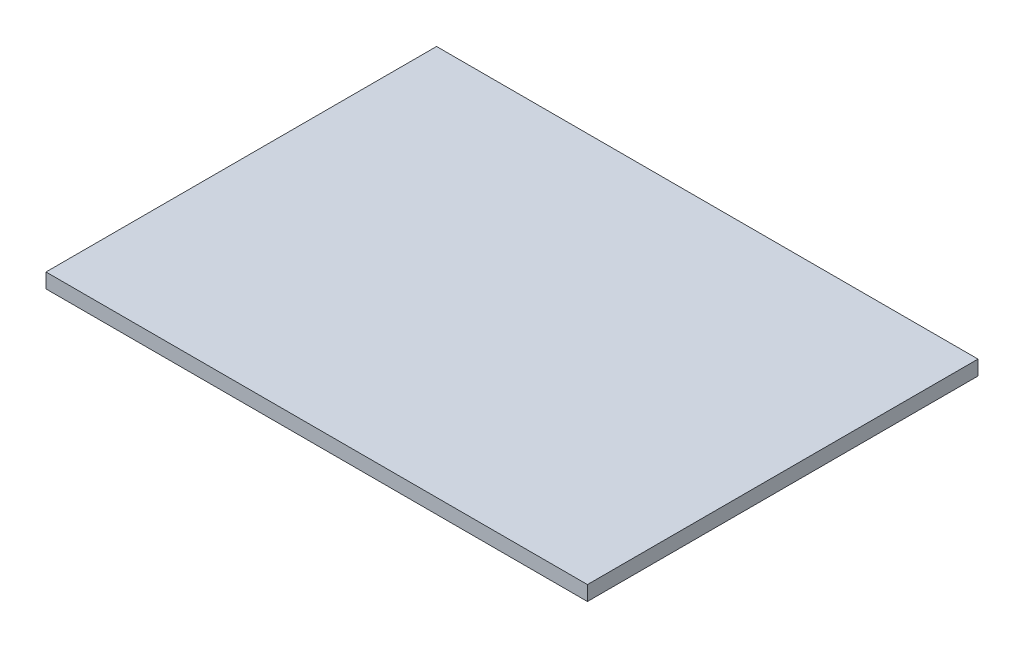
ISO-10303-21;
HEADER;
FILE_DESCRIPTION(('STEP AP214'),'2;1');
FILE_NAME('part.step','',(''),(''),'','','');
FILE_SCHEMA(('AUTOMOTIVE_DESIGN { 1 0 10303 214 1 1 1 1 }'));
ENDSEC;
DATA;
#1=APPLICATION_CONTEXT('core data for automotive mechanical design processes');
#2=APPLICATION_PROTOCOL_DEFINITION('international standard','automotive_design',2000,#1);
#3=PRODUCT_CONTEXT('',#1,'mechanical');
#4=PRODUCT('Part','Part','',(#3));
#5=PRODUCT_RELATED_PRODUCT_CATEGORY('part','',(#4));
#6=PRODUCT_DEFINITION_FORMATION('','',#4);
#7=PRODUCT_DEFINITION_CONTEXT('part definition',#1,'design');
#8=PRODUCT_DEFINITION('design','',#6,#7);
#9=PRODUCT_DEFINITION_SHAPE('','',#8);
#10=(LENGTH_UNIT() NAMED_UNIT(*) SI_UNIT(.MILLI.,.METRE.));
#11=(NAMED_UNIT(*) PLANE_ANGLE_UNIT() SI_UNIT($,.RADIAN.));
#12=(NAMED_UNIT(*) SI_UNIT($,.STERADIAN.) SOLID_ANGLE_UNIT());
#13=UNCERTAINTY_MEASURE_WITH_UNIT(LENGTH_MEASURE(1.E-05),#10,'distance_accuracy_value','');
#14=(GEOMETRIC_REPRESENTATION_CONTEXT(3) GLOBAL_UNCERTAINTY_ASSIGNED_CONTEXT((#13)) GLOBAL_UNIT_ASSIGNED_CONTEXT((#10,
#11,#12)) REPRESENTATION_CONTEXT('',''));
#15=CARTESIAN_POINT('',(0.,0.,0.));
#16=DIRECTION('',(0.,0.,1.));
#17=DIRECTION('',(1.,0.,0.));
#18=AXIS2_PLACEMENT_3D('',#15,#16,#17);
#19=CARTESIAN_POINT('',(0.,0.725,0.));
#20=DIRECTION('',(-1.,0.,0.));
#21=DIRECTION('',(0.,0.,1.));
#22=AXIS2_PLACEMENT_3D('',#19,#20,#21);
#23=PLANE('',#22);
#24=DIRECTION('',(0.,0.,-1.));
#25=VECTOR('',#24,1.);
#26=CARTESIAN_POINT('',(0.,0.,0.));
#27=LINE('',#26,#25);
#28=CARTESIAN_POINT('',(0.,0.,0.));
#29=VERTEX_POINT('',#28);
#30=CARTESIAN_POINT('',(0.,0.,-19.2599999999999));
#31=VERTEX_POINT('',#30);
#32=EDGE_CURVE('E95',#29,#31,#27,.T.);
#33=ORIENTED_EDGE('',*,*,#32,.T.);
#34=DIRECTION('',(0.,-1.,0.));
#35=VECTOR('',#34,1.);
#36=CARTESIAN_POINT('',(0.,0.725,-19.2599999999999));
#37=LINE('',#36,#35);
#38=CARTESIAN_POINT('',(0.,0.725,-19.2599999999999));
#39=VERTEX_POINT('',#38);
#40=EDGE_CURVE('E11',#39,#31,#37,.T.);
#41=ORIENTED_EDGE('',*,*,#40,.F.);
#42=DIRECTION('',(0.,0.,-1.));
#43=VECTOR('',#42,1.);
#44=CARTESIAN_POINT('',(0.,0.725,0.));
#45=LINE('',#44,#43);
#46=CARTESIAN_POINT('',(0.,0.725,0.));
#47=VERTEX_POINT('',#46);
#48=EDGE_CURVE('E83',#47,#39,#45,.T.);
#49=ORIENTED_EDGE('',*,*,#48,.F.);
#50=DIRECTION('',(0.,-1.,0.));
#51=VECTOR('',#50,1.);
#52=CARTESIAN_POINT('',(0.,0.725,0.));
#53=LINE('',#52,#51);
#54=EDGE_CURVE('E91',#47,#29,#53,.T.);
#55=ORIENTED_EDGE('',*,*,#54,.T.);
#56=EDGE_LOOP('',(#33,#41,#49,#55));
#57=FACE_BOUND('',#56,.T.);
#58=ADVANCED_FACE('F32',(#57),#23,.F.);
#59=CARTESIAN_POINT('',(0.,0.725,-19.2599999999999));
#60=DIRECTION('',(0.,0.,1.));
#61=DIRECTION('',(1.,0.,0.));
#62=AXIS2_PLACEMENT_3D('',#59,#60,#61);
#63=PLANE('',#62);
#64=DIRECTION('',(-1.,0.,0.));
#65=VECTOR('',#64,1.);
#66=CARTESIAN_POINT('',(0.,0.,-19.2599999999999));
#67=LINE('',#66,#65);
#68=CARTESIAN_POINT('',(-26.7,0.,-19.2599999999999));
#69=VERTEX_POINT('',#68);
#70=EDGE_CURVE('E87',#31,#69,#67,.T.);
#71=ORIENTED_EDGE('',*,*,#70,.T.);
#72=DIRECTION('',(0.,-1.,0.));
#73=VECTOR('',#72,1.);
#74=CARTESIAN_POINT('',(-26.7,0.725,-19.2599999999999));
#75=LINE('',#74,#73);
#76=CARTESIAN_POINT('',(-26.7,0.725,-19.2599999999999));
#77=VERTEX_POINT('',#76);
#78=EDGE_CURVE('E40',#77,#69,#75,.T.);
#79=ORIENTED_EDGE('',*,*,#78,.F.);
#80=DIRECTION('',(-1.,0.,0.));
#81=VECTOR('',#80,1.);
#82=CARTESIAN_POINT('',(0.,0.725,-19.2599999999999));
#83=LINE('',#82,#81);
#84=EDGE_CURVE('E78',#39,#77,#83,.T.);
#85=ORIENTED_EDGE('',*,*,#84,.F.);
#86=ORIENTED_EDGE('',*,*,#40,.T.);
#87=EDGE_LOOP('',(#71,#79,#85,#86));
#88=FACE_BOUND('',#87,.T.);
#89=ADVANCED_FACE('F86',(#88),#63,.F.);
#90=CARTESIAN_POINT('',(-26.7,0.725,0.));
#91=DIRECTION('',(1.,0.,0.));
#92=DIRECTION('',(0.,0.,-1.));
#93=AXIS2_PLACEMENT_3D('',#90,#91,#92);
#94=PLANE('',#93);
#95=DIRECTION('',(0.,0.,1.));
#96=VECTOR('',#95,1.);
#97=CARTESIAN_POINT('',(-26.7,0.,0.));
#98=LINE('',#97,#96);
#99=CARTESIAN_POINT('',(-26.7,0.,0.));
#100=VERTEX_POINT('',#99);
#101=EDGE_CURVE('E65',#69,#100,#98,.T.);
#102=ORIENTED_EDGE('',*,*,#101,.T.);
#103=DIRECTION('',(0.,-1.,0.));
#104=VECTOR('',#103,1.);
#105=CARTESIAN_POINT('',(-26.7,0.725,0.));
#106=LINE('',#105,#104);
#107=CARTESIAN_POINT('',(-26.7,0.725,0.));
#108=VERTEX_POINT('',#107);
#109=EDGE_CURVE('E88',#108,#100,#106,.T.);
#110=ORIENTED_EDGE('',*,*,#109,.F.);
#111=DIRECTION('',(0.,0.,1.));
#112=VECTOR('',#111,1.);
#113=CARTESIAN_POINT('',(-26.7,0.725,0.));
#114=LINE('',#113,#112);
#115=EDGE_CURVE('E81',#77,#108,#114,.T.);
#116=ORIENTED_EDGE('',*,*,#115,.F.);
#117=ORIENTED_EDGE('',*,*,#78,.T.);
#118=EDGE_LOOP('',(#102,#110,#116,#117));
#119=FACE_BOUND('',#118,.T.);
#120=ADVANCED_FACE('F89',(#119),#94,.F.);
#121=CARTESIAN_POINT('',(0.,0.725,0.));
#122=DIRECTION('',(0.,0.,-1.));
#123=DIRECTION('',(-1.,0.,0.));
#124=AXIS2_PLACEMENT_3D('',#121,#122,#123);
#125=PLANE('',#124);
#126=DIRECTION('',(1.,0.,0.));
#127=VECTOR('',#126,1.);
#128=CARTESIAN_POINT('',(0.,0.,0.));
#129=LINE('',#128,#127);
#130=EDGE_CURVE('E71',#100,#29,#129,.T.);
#131=ORIENTED_EDGE('',*,*,#130,.T.);
#132=ORIENTED_EDGE('',*,*,#54,.F.);
#133=DIRECTION('',(1.,0.,0.));
#134=VECTOR('',#133,1.);
#135=CARTESIAN_POINT('',(0.,0.725,0.));
#136=LINE('',#135,#134);
#137=EDGE_CURVE('E48',#108,#47,#136,.T.);
#138=ORIENTED_EDGE('',*,*,#137,.F.);
#139=ORIENTED_EDGE('',*,*,#109,.T.);
#140=EDGE_LOOP('',(#131,#132,#138,#139));
#141=FACE_BOUND('',#140,.T.);
#142=ADVANCED_FACE('F102',(#141),#125,.F.);
#143=CARTESIAN_POINT('',(0.,0.725,0.));
#144=DIRECTION('',(0.,1.,0.));
#145=DIRECTION('',(0.,0.,1.));
#146=AXIS2_PLACEMENT_3D('',#143,#144,#145);
#147=PLANE('',#146);
#148=ORIENTED_EDGE('',*,*,#48,.T.);
#149=ORIENTED_EDGE('',*,*,#84,.T.);
#150=ORIENTED_EDGE('',*,*,#115,.T.);
#151=ORIENTED_EDGE('',*,*,#137,.T.);
#152=EDGE_LOOP('',(#148,#149,#150,#151));
#153=FACE_BOUND('',#152,.T.);
#154=ADVANCED_FACE('F79',(#153),#147,.T.);
#155=CARTESIAN_POINT('',(0.,0.,0.));
#156=DIRECTION('',(0.,1.,0.));
#157=DIRECTION('',(0.,0.,1.));
#158=AXIS2_PLACEMENT_3D('',#155,#156,#157);
#159=PLANE('',#158);
#160=ORIENTED_EDGE('',*,*,#32,.F.);
#161=ORIENTED_EDGE('',*,*,#130,.F.);
#162=ORIENTED_EDGE('',*,*,#101,.F.);
#163=ORIENTED_EDGE('',*,*,#70,.F.);
#164=EDGE_LOOP('',(#160,#161,#162,#163));
#165=FACE_BOUND('',#164,.T.);
#166=ADVANCED_FACE('F105',(#165),#159,.F.);
#167=CLOSED_SHELL('',(#58,#89,#120,#142,#154,#166));
#168=MANIFOLD_SOLID_BREP('B2',#167);
#169=ADVANCED_BREP_SHAPE_REPRESENTATION('',(#18,#168),#14);
#170=SHAPE_DEFINITION_REPRESENTATION(#9,#169);
ENDSEC;
END-ISO-10303-21;
